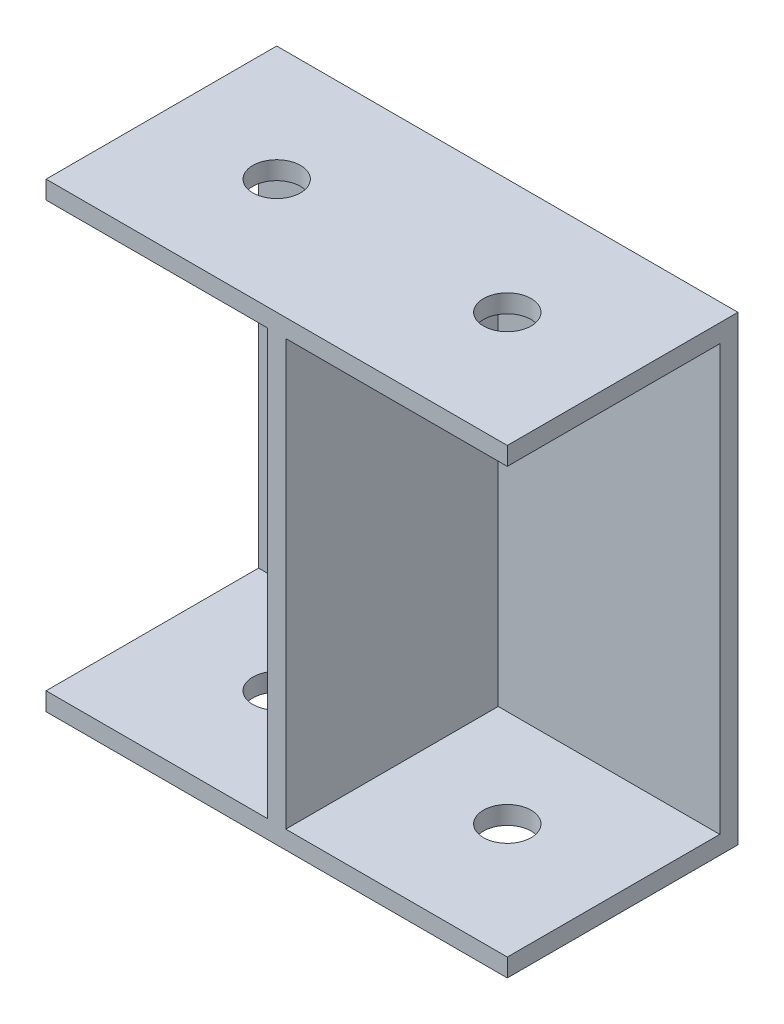
ISO-10303-21;
HEADER;
FILE_DESCRIPTION(('STEP AP214'),'2;1');
FILE_NAME('part.step','',(''),(''),'','','');
FILE_SCHEMA(('AUTOMOTIVE_DESIGN { 1 0 10303 214 1 1 1 1 }'));
ENDSEC;
DATA;
#1=APPLICATION_CONTEXT('core data for automotive mechanical design processes');
#2=APPLICATION_PROTOCOL_DEFINITION('international standard','automotive_design',2000,#1);
#3=PRODUCT_CONTEXT('',#1,'mechanical');
#4=PRODUCT('Part','Part','',(#3));
#5=PRODUCT_RELATED_PRODUCT_CATEGORY('part','',(#4));
#6=PRODUCT_DEFINITION_FORMATION('','',#4);
#7=PRODUCT_DEFINITION_CONTEXT('part definition',#1,'design');
#8=PRODUCT_DEFINITION('design','',#6,#7);
#9=PRODUCT_DEFINITION_SHAPE('','',#8);
#10=(LENGTH_UNIT() NAMED_UNIT(*) SI_UNIT(.MILLI.,.METRE.));
#11=(NAMED_UNIT(*) PLANE_ANGLE_UNIT() SI_UNIT($,.RADIAN.));
#12=(NAMED_UNIT(*) SI_UNIT($,.STERADIAN.) SOLID_ANGLE_UNIT());
#13=UNCERTAINTY_MEASURE_WITH_UNIT(LENGTH_MEASURE(1.E-05),#10,'distance_accuracy_value','');
#14=(GEOMETRIC_REPRESENTATION_CONTEXT(3) GLOBAL_UNCERTAINTY_ASSIGNED_CONTEXT((#13)) GLOBAL_UNIT_ASSIGNED_CONTEXT((#10,
#11,#12)) REPRESENTATION_CONTEXT('',''));
#15=CARTESIAN_POINT('',(0.,0.,0.));
#16=DIRECTION('',(0.,0.,1.));
#17=DIRECTION('',(1.,0.,0.));
#18=AXIS2_PLACEMENT_3D('',#15,#16,#17);
#19=CARTESIAN_POINT('',(38.1,-38.1,38.1));
#20=DIRECTION('',(-1.,0.,0.));
#21=DIRECTION('',(0.,0.,1.));
#22=AXIS2_PLACEMENT_3D('',#19,#20,#21);
#23=PLANE('',#22);
#24=DIRECTION('',(0.,1.,0.));
#25=VECTOR('',#24,1.);
#26=CARTESIAN_POINT('',(38.1,-38.1,38.1));
#27=LINE('',#26,#25);
#28=CARTESIAN_POINT('',(38.1,35.099999904,38.1));
#29=VERTEX_POINT('',#28);
#30=CARTESIAN_POINT('',(38.1,38.1,38.1));
#31=VERTEX_POINT('',#30);
#32=EDGE_CURVE('E181',#29,#31,#27,.T.);
#33=ORIENTED_EDGE('',*,*,#32,.F.);
#34=DIRECTION('',(0.,0.,-1.));
#35=VECTOR('',#34,1.);
#36=CARTESIAN_POINT('',(38.1,35.099999904,38.1));
#37=LINE('',#36,#35);
#38=CARTESIAN_POINT('',(38.1,35.099999904,2.9999999944));
#39=VERTEX_POINT('',#38);
#40=EDGE_CURVE('E173',#29,#39,#37,.T.);
#41=ORIENTED_EDGE('',*,*,#40,.T.);
#42=DIRECTION('',(0.,-1.,0.));
#43=VECTOR('',#42,1.);
#44=CARTESIAN_POINT('',(38.1,-38.1,2.9999999944));
#45=LINE('',#44,#43);
#46=CARTESIAN_POINT('',(38.1,-35.099999904,2.9999999944));
#47=VERTEX_POINT('',#46);
#48=EDGE_CURVE('E212',#39,#47,#45,.T.);
#49=ORIENTED_EDGE('',*,*,#48,.T.);
#50=DIRECTION('',(0.,0.,1.));
#51=VECTOR('',#50,1.);
#52=CARTESIAN_POINT('',(38.1,-35.099999904,38.1));
#53=LINE('',#52,#51);
#54=CARTESIAN_POINT('',(38.1,-35.099999904,38.1));
#55=VERTEX_POINT('',#54);
#56=EDGE_CURVE('E169',#47,#55,#53,.T.);
#57=ORIENTED_EDGE('',*,*,#56,.T.);
#58=CARTESIAN_POINT('',(38.1,-38.1,38.1));
#59=VERTEX_POINT('',#58);
#60=EDGE_CURVE('E177',#59,#55,#27,.T.);
#61=ORIENTED_EDGE('',*,*,#60,.F.);
#62=DIRECTION('',(0.,0.,-1.));
#63=VECTOR('',#62,1.);
#64=CARTESIAN_POINT('',(38.1,-38.1,38.1));
#65=LINE('',#64,#63);
#66=CARTESIAN_POINT('',(38.1,-38.1,0.));
#67=VERTEX_POINT('',#66);
#68=EDGE_CURVE('E189',#59,#67,#65,.T.);
#69=ORIENTED_EDGE('',*,*,#68,.T.);
#70=DIRECTION('',(0.,1.,0.));
#71=VECTOR('',#70,1.);
#72=CARTESIAN_POINT('',(38.1,-38.1,0.));
#73=LINE('',#72,#71);
#74=CARTESIAN_POINT('',(38.1,38.1,0.));
#75=VERTEX_POINT('',#74);
#76=EDGE_CURVE('E176',#67,#75,#73,.T.);
#77=ORIENTED_EDGE('',*,*,#76,.T.);
#78=DIRECTION('',(0.,0.,-1.));
#79=VECTOR('',#78,1.);
#80=CARTESIAN_POINT('',(38.1,38.1,38.1));
#81=LINE('',#80,#79);
#82=EDGE_CURVE('E206',#31,#75,#81,.T.);
#83=ORIENTED_EDGE('',*,*,#82,.F.);
#84=EDGE_LOOP('',(#33,#41,#49,#57,#61,#69,#77,#83));
#85=FACE_BOUND('',#84,.T.);
#86=ADVANCED_FACE('F32',(#85),#23,.F.);
#87=CARTESIAN_POINT('',(-38.1,38.1,38.1));
#88=DIRECTION('',(0.,-1.,0.));
#89=DIRECTION('',(0.,0.,-1.));
#90=AXIS2_PLACEMENT_3D('',#87,#88,#89);
#91=PLANE('',#90);
#92=CARTESIAN_POINT('',(-19.05,38.1,19.05));
#93=DIRECTION('',(0.,1.,0.));
#94=DIRECTION('',(0.,0.,-1.));
#95=AXIS2_PLACEMENT_3D('',#92,#93,#94);
#96=CIRCLE('',#95,3.937);
#97=CARTESIAN_POINT('',(-19.05,38.1,22.987));
#98=VERTEX_POINT('',#97);
#99=EDGE_CURVE('E232',#98,#98,#96,.T.);
#100=ORIENTED_EDGE('',*,*,#99,.F.);
#101=EDGE_LOOP('',(#100));
#102=FACE_BOUND('',#101,.T.);
#103=CARTESIAN_POINT('',(19.05,38.1,19.05));
#104=DIRECTION('',(0.,1.,0.));
#105=DIRECTION('',(0.,0.,1.));
#106=AXIS2_PLACEMENT_3D('',#103,#104,#105);
#107=CIRCLE('',#106,3.937);
#108=CARTESIAN_POINT('',(19.05,38.1,22.987));
#109=VERTEX_POINT('',#108);
#110=EDGE_CURVE('E222',#109,#109,#107,.T.);
#111=ORIENTED_EDGE('',*,*,#110,.F.);
#112=EDGE_LOOP('',(#111));
#113=FACE_BOUND('',#112,.T.);
#114=DIRECTION('',(-1.,0.,0.));
#115=VECTOR('',#114,1.);
#116=CARTESIAN_POINT('',(-38.1,38.1,0.));
#117=LINE('',#116,#115);
#118=CARTESIAN_POINT('',(-38.1,38.1,0.));
#119=VERTEX_POINT('',#118);
#120=EDGE_CURVE('E192',#75,#119,#117,.T.);
#121=ORIENTED_EDGE('',*,*,#120,.T.);
#122=DIRECTION('',(0.,0.,-1.));
#123=VECTOR('',#122,1.);
#124=CARTESIAN_POINT('',(-38.1,38.1,38.1));
#125=LINE('',#124,#123);
#126=CARTESIAN_POINT('',(-38.1,38.1,38.1));
#127=VERTEX_POINT('',#126);
#128=EDGE_CURVE('E203',#127,#119,#125,.T.);
#129=ORIENTED_EDGE('',*,*,#128,.F.);
#130=DIRECTION('',(-1.,0.,0.));
#131=VECTOR('',#130,1.);
#132=CARTESIAN_POINT('',(-38.1,38.1,38.1));
#133=LINE('',#132,#131);
#134=EDGE_CURVE('E180',#31,#127,#133,.T.);
#135=ORIENTED_EDGE('',*,*,#134,.F.);
#136=ORIENTED_EDGE('',*,*,#82,.T.);
#137=EDGE_LOOP('',(#121,#129,#135,#136));
#138=FACE_BOUND('',#137,.T.);
#139=ADVANCED_FACE('F260',(#102,#113,#138),#91,.F.);
#140=CARTESIAN_POINT('',(-38.1,-38.1,38.1));
#141=DIRECTION('',(1.,0.,0.));
#142=DIRECTION('',(0.,0.,-1.));
#143=AXIS2_PLACEMENT_3D('',#140,#141,#142);
#144=PLANE('',#143);
#145=DIRECTION('',(0.,-1.,0.));
#146=VECTOR('',#145,1.);
#147=CARTESIAN_POINT('',(-38.1,-38.1,38.1));
#148=LINE('',#147,#146);
#149=CARTESIAN_POINT('',(-38.1,-35.099999904,38.1));
#150=VERTEX_POINT('',#149);
#151=CARTESIAN_POINT('',(-38.1,-38.1,38.1));
#152=VERTEX_POINT('',#151);
#153=EDGE_CURVE('E183',#150,#152,#148,.T.);
#154=ORIENTED_EDGE('',*,*,#153,.F.);
#155=DIRECTION('',(0.,0.,-1.));
#156=VECTOR('',#155,1.);
#157=CARTESIAN_POINT('',(-38.1,-35.099999904,38.1));
#158=LINE('',#157,#156);
#159=CARTESIAN_POINT('',(-38.1,-35.099999904,2.9999999944));
#160=VERTEX_POINT('',#159);
#161=EDGE_CURVE('E153',#150,#160,#158,.T.);
#162=ORIENTED_EDGE('',*,*,#161,.T.);
#163=DIRECTION('',(0.,1.,0.));
#164=VECTOR('',#163,1.);
#165=CARTESIAN_POINT('',(-38.1,-38.1,2.9999999944));
#166=LINE('',#165,#164);
#167=CARTESIAN_POINT('',(-38.1,35.099999904,2.9999999944));
#168=VERTEX_POINT('',#167);
#169=EDGE_CURVE('E11',#160,#168,#166,.T.);
#170=ORIENTED_EDGE('',*,*,#169,.T.);
#171=DIRECTION('',(0.,0.,1.));
#172=VECTOR('',#171,1.);
#173=CARTESIAN_POINT('',(-38.1,35.099999904,38.1));
#174=LINE('',#173,#172);
#175=CARTESIAN_POINT('',(-38.1,35.099999904,38.1));
#176=VERTEX_POINT('',#175);
#177=EDGE_CURVE('E149',#168,#176,#174,.T.);
#178=ORIENTED_EDGE('',*,*,#177,.T.);
#179=EDGE_CURVE('E184',#127,#176,#148,.T.);
#180=ORIENTED_EDGE('',*,*,#179,.F.);
#181=ORIENTED_EDGE('',*,*,#128,.T.);
#182=DIRECTION('',(0.,-1.,0.));
#183=VECTOR('',#182,1.);
#184=CARTESIAN_POINT('',(-38.1,-38.1,0.));
#185=LINE('',#184,#183);
#186=CARTESIAN_POINT('',(-38.1,-38.1,0.));
#187=VERTEX_POINT('',#186);
#188=EDGE_CURVE('E194',#119,#187,#185,.T.);
#189=ORIENTED_EDGE('',*,*,#188,.T.);
#190=DIRECTION('',(0.,0.,-1.));
#191=VECTOR('',#190,1.);
#192=CARTESIAN_POINT('',(-38.1,-38.1,38.1));
#193=LINE('',#192,#191);
#194=EDGE_CURVE('E200',#152,#187,#193,.T.);
#195=ORIENTED_EDGE('',*,*,#194,.F.);
#196=EDGE_LOOP('',(#154,#162,#170,#178,#180,#181,#189,#195));
#197=FACE_BOUND('',#196,.T.);
#198=ADVANCED_FACE('F265',(#197),#144,.F.);
#199=CARTESIAN_POINT('',(-38.1,-38.1,38.1));
#200=DIRECTION('',(0.,1.,0.));
#201=DIRECTION('',(0.,0.,1.));
#202=AXIS2_PLACEMENT_3D('',#199,#200,#201);
#203=PLANE('',#202);
#204=CARTESIAN_POINT('',(-19.05,-38.1,19.05));
#205=DIRECTION('',(0.,1.,0.));
#206=DIRECTION('',(0.,0.,-1.));
#207=AXIS2_PLACEMENT_3D('',#204,#205,#206);
#208=CIRCLE('',#207,3.937);
#209=CARTESIAN_POINT('',(-19.05,-38.1,22.987));
#210=VERTEX_POINT('',#209);
#211=EDGE_CURVE('E235',#210,#210,#208,.T.);
#212=ORIENTED_EDGE('',*,*,#211,.T.);
#213=EDGE_LOOP('',(#212));
#214=FACE_BOUND('',#213,.T.);
#215=CARTESIAN_POINT('',(19.05,-38.1,19.05));
#216=DIRECTION('',(0.,1.,0.));
#217=DIRECTION('',(0.,0.,1.));
#218=AXIS2_PLACEMENT_3D('',#215,#216,#217);
#219=CIRCLE('',#218,3.937);
#220=CARTESIAN_POINT('',(19.05,-38.1,22.987));
#221=VERTEX_POINT('',#220);
#222=EDGE_CURVE('E217',#221,#221,#219,.T.);
#223=ORIENTED_EDGE('',*,*,#222,.T.);
#224=EDGE_LOOP('',(#223));
#225=FACE_BOUND('',#224,.T.);
#226=DIRECTION('',(1.,0.,0.));
#227=VECTOR('',#226,1.);
#228=CARTESIAN_POINT('',(-38.1,-38.1,0.));
#229=LINE('',#228,#227);
#230=EDGE_CURVE('E196',#187,#67,#229,.T.);
#231=ORIENTED_EDGE('',*,*,#230,.T.);
#232=ORIENTED_EDGE('',*,*,#68,.F.);
#233=DIRECTION('',(1.,0.,0.));
#234=VECTOR('',#233,1.);
#235=CARTESIAN_POINT('',(-38.1,-38.1,38.1));
#236=LINE('',#235,#234);
#237=EDGE_CURVE('E187',#152,#59,#236,.T.);
#238=ORIENTED_EDGE('',*,*,#237,.F.);
#239=ORIENTED_EDGE('',*,*,#194,.T.);
#240=EDGE_LOOP('',(#231,#232,#238,#239));
#241=FACE_BOUND('',#240,.T.);
#242=ADVANCED_FACE('F284',(#214,#225,#241),#203,.F.);
#243=CARTESIAN_POINT('',(0.,0.,38.1));
#244=DIRECTION('',(0.,0.,-1.));
#245=DIRECTION('',(-1.,0.,0.));
#246=AXIS2_PLACEMENT_3D('',#243,#244,#245);
#247=PLANE('',#246);
#248=DIRECTION('',(0.,1.,0.));
#249=VECTOR('',#248,1.);
#250=CARTESIAN_POINT('',(-1.4999999012,-35.099999904,38.1));
#251=LINE('',#250,#249);
#252=CARTESIAN_POINT('',(-1.4999999012,-35.099999904,38.1));
#253=VERTEX_POINT('',#252);
#254=CARTESIAN_POINT('',(-1.4999999012,35.099999904,38.1));
#255=VERTEX_POINT('',#254);
#256=EDGE_CURVE('E145',#253,#255,#251,.T.);
#257=ORIENTED_EDGE('',*,*,#256,.F.);
#258=DIRECTION('',(-1.,0.,0.));
#259=VECTOR('',#258,1.);
#260=CARTESIAN_POINT('',(0.,-35.099999904,38.1));
#261=LINE('',#260,#259);
#262=EDGE_CURVE('E40',#253,#150,#261,.T.);
#263=ORIENTED_EDGE('',*,*,#262,.T.);
#264=ORIENTED_EDGE('',*,*,#153,.T.);
#265=ORIENTED_EDGE('',*,*,#237,.T.);
#266=ORIENTED_EDGE('',*,*,#60,.T.);
#267=DIRECTION('',(1.,0.,0.));
#268=VECTOR('',#267,1.);
#269=CARTESIAN_POINT('',(1.5000000932,-35.099999904,38.1));
#270=LINE('',#269,#268);
#271=CARTESIAN_POINT('',(1.5000000932,-35.099999904,38.1));
#272=VERTEX_POINT('',#271);
#273=EDGE_CURVE('E159',#272,#55,#270,.T.);
#274=ORIENTED_EDGE('',*,*,#273,.F.);
#275=DIRECTION('',(0.,-1.,0.));
#276=VECTOR('',#275,1.);
#277=CARTESIAN_POINT('',(1.5000000932,-35.099999904,38.1));
#278=LINE('',#277,#276);
#279=CARTESIAN_POINT('',(1.5000000932,35.099999904,38.1));
#280=VERTEX_POINT('',#279);
#281=EDGE_CURVE('E56',#280,#272,#278,.T.);
#282=ORIENTED_EDGE('',*,*,#281,.F.);
#283=DIRECTION('',(1.,0.,0.));
#284=VECTOR('',#283,1.);
#285=CARTESIAN_POINT('',(0.,35.099999904,38.1));
#286=LINE('',#285,#284);
#287=EDGE_CURVE('E209',#280,#29,#286,.T.);
#288=ORIENTED_EDGE('',*,*,#287,.T.);
#289=ORIENTED_EDGE('',*,*,#32,.T.);
#290=ORIENTED_EDGE('',*,*,#134,.T.);
#291=ORIENTED_EDGE('',*,*,#179,.T.);
#292=DIRECTION('',(-1.,0.,0.));
#293=VECTOR('',#292,1.);
#294=CARTESIAN_POINT('',(-1.4999999012,35.099999904,38.1));
#295=LINE('',#294,#293);
#296=EDGE_CURVE('E131',#255,#176,#295,.T.);
#297=ORIENTED_EDGE('',*,*,#296,.F.);
#298=EDGE_LOOP('',(#257,#263,#264,#265,#266,#274,#282,#288,#289,#290,#291,#297));
#299=FACE_BOUND('',#298,.T.);
#300=ADVANCED_FACE('F271',(#299),#247,.F.);
#301=CARTESIAN_POINT('',(0.,0.,0.));
#302=DIRECTION('',(0.,0.,-1.));
#303=DIRECTION('',(-1.,0.,0.));
#304=AXIS2_PLACEMENT_3D('',#301,#302,#303);
#305=PLANE('',#304);
#306=ORIENTED_EDGE('',*,*,#76,.F.);
#307=ORIENTED_EDGE('',*,*,#230,.F.);
#308=ORIENTED_EDGE('',*,*,#188,.F.);
#309=ORIENTED_EDGE('',*,*,#120,.F.);
#310=EDGE_LOOP('',(#306,#307,#308,#309));
#311=FACE_BOUND('',#310,.T.);
#312=ADVANCED_FACE('F307',(#311),#305,.T.);
#313=CARTESIAN_POINT('',(0.,0.,2.9999999944));
#314=DIRECTION('',(0.,0.,-1.));
#315=DIRECTION('',(-1.,0.,0.));
#316=AXIS2_PLACEMENT_3D('',#313,#314,#315);
#317=PLANE('',#316);
#318=DIRECTION('',(-1.,0.,0.));
#319=VECTOR('',#318,1.);
#320=CARTESIAN_POINT('',(1.5000000932,35.099999904,2.9999999944));
#321=LINE('',#320,#319);
#322=CARTESIAN_POINT('',(1.5000000932,35.099999904,2.9999999944));
#323=VERTEX_POINT('',#322);
#324=EDGE_CURVE('E162',#39,#323,#321,.T.);
#325=ORIENTED_EDGE('',*,*,#324,.T.);
#326=DIRECTION('',(0.,-1.,0.));
#327=VECTOR('',#326,1.);
#328=CARTESIAN_POINT('',(1.5000000932,-35.099999904,2.9999999944));
#329=LINE('',#328,#327);
#330=CARTESIAN_POINT('',(1.5000000932,-35.099999904,2.9999999944));
#331=VERTEX_POINT('',#330);
#332=EDGE_CURVE('E155',#323,#331,#329,.T.);
#333=ORIENTED_EDGE('',*,*,#332,.T.);
#334=DIRECTION('',(1.,0.,0.));
#335=VECTOR('',#334,1.);
#336=CARTESIAN_POINT('',(1.5000000932,-35.099999904,2.9999999944));
#337=LINE('',#336,#335);
#338=EDGE_CURVE('E158',#331,#47,#337,.T.);
#339=ORIENTED_EDGE('',*,*,#338,.T.);
#340=ORIENTED_EDGE('',*,*,#48,.F.);
#341=EDGE_LOOP('',(#325,#333,#339,#340));
#342=FACE_BOUND('',#341,.T.);
#343=ADVANCED_FACE('F295',(#342),#317,.F.);
#344=CARTESIAN_POINT('',(1.5000000932,35.099999904,2.9999999944));
#345=DIRECTION('',(0.,1.,0.));
#346=DIRECTION('',(0.,0.,1.));
#347=AXIS2_PLACEMENT_3D('',#344,#345,#346);
#348=PLANE('',#347);
#349=CARTESIAN_POINT('',(19.05,35.099999904,19.05));
#350=DIRECTION('',(0.,1.,0.));
#351=DIRECTION('',(0.,0.,1.));
#352=AXIS2_PLACEMENT_3D('',#349,#350,#351);
#353=CIRCLE('',#352,3.937);
#354=CARTESIAN_POINT('',(19.05,35.099999904,22.987));
#355=VERTEX_POINT('',#354);
#356=EDGE_CURVE('E147',#355,#355,#353,.T.);
#357=ORIENTED_EDGE('',*,*,#356,.T.);
#358=EDGE_LOOP('',(#357));
#359=FACE_BOUND('',#358,.T.);
#360=ORIENTED_EDGE('',*,*,#287,.F.);
#361=DIRECTION('',(0.,0.,1.));
#362=VECTOR('',#361,1.);
#363=CARTESIAN_POINT('',(1.5000000932,35.099999904,2.9999999944));
#364=LINE('',#363,#362);
#365=EDGE_CURVE('E167',#323,#280,#364,.T.);
#366=ORIENTED_EDGE('',*,*,#365,.F.);
#367=ORIENTED_EDGE('',*,*,#324,.F.);
#368=ORIENTED_EDGE('',*,*,#40,.F.);
#369=EDGE_LOOP('',(#360,#366,#367,#368));
#370=FACE_BOUND('',#369,.T.);
#371=ADVANCED_FACE('F298',(#359,#370),#348,.F.);
#372=CARTESIAN_POINT('',(1.5000000932,-35.099999904,2.9999999944));
#373=DIRECTION('',(0.,-1.,0.));
#374=DIRECTION('',(0.,0.,-1.));
#375=AXIS2_PLACEMENT_3D('',#372,#373,#374);
#376=PLANE('',#375);
#377=CARTESIAN_POINT('',(19.05,-35.099999904,19.05));
#378=DIRECTION('',(0.,-1.,0.));
#379=DIRECTION('',(0.,0.,-1.));
#380=AXIS2_PLACEMENT_3D('',#377,#378,#379);
#381=CIRCLE('',#380,3.937);
#382=CARTESIAN_POINT('',(19.05,-35.099999904,22.987));
#383=VERTEX_POINT('',#382);
#384=EDGE_CURVE('E215',#383,#383,#381,.T.);
#385=ORIENTED_EDGE('',*,*,#384,.T.);
#386=EDGE_LOOP('',(#385));
#387=FACE_BOUND('',#386,.T.);
#388=ORIENTED_EDGE('',*,*,#338,.F.);
#389=DIRECTION('',(0.,0.,1.));
#390=VECTOR('',#389,1.);
#391=CARTESIAN_POINT('',(1.5000000932,-35.099999904,2.9999999944));
#392=LINE('',#391,#390);
#393=EDGE_CURVE('E164',#331,#272,#392,.T.);
#394=ORIENTED_EDGE('',*,*,#393,.T.);
#395=ORIENTED_EDGE('',*,*,#273,.T.);
#396=ORIENTED_EDGE('',*,*,#56,.F.);
#397=EDGE_LOOP('',(#388,#394,#395,#396));
#398=FACE_BOUND('',#397,.T.);
#399=ADVANCED_FACE('F290',(#387,#398),#376,.F.);
#400=CARTESIAN_POINT('',(1.5000000932,-35.099999904,2.9999999944));
#401=DIRECTION('',(-1.,0.,0.));
#402=DIRECTION('',(0.,0.,1.));
#403=AXIS2_PLACEMENT_3D('',#400,#401,#402);
#404=PLANE('',#403);
#405=ORIENTED_EDGE('',*,*,#281,.T.);
#406=ORIENTED_EDGE('',*,*,#393,.F.);
#407=ORIENTED_EDGE('',*,*,#332,.F.);
#408=ORIENTED_EDGE('',*,*,#365,.T.);
#409=EDGE_LOOP('',(#405,#406,#407,#408));
#410=FACE_BOUND('',#409,.T.);
#411=ADVANCED_FACE('F292',(#410),#404,.F.);
#412=CARTESIAN_POINT('',(0.,0.,2.9999999944));
#413=DIRECTION('',(0.,0.,-1.));
#414=DIRECTION('',(-1.,0.,0.));
#415=AXIS2_PLACEMENT_3D('',#412,#413,#414);
#416=PLANE('',#415);
#417=DIRECTION('',(1.,0.,0.));
#418=VECTOR('',#417,1.);
#419=CARTESIAN_POINT('',(-1.4999999012,-35.099999904,2.9999999944));
#420=LINE('',#419,#418);
#421=CARTESIAN_POINT('',(-1.4999999012,-35.099999904,2.9999999944));
#422=VERTEX_POINT('',#421);
#423=EDGE_CURVE('E125',#160,#422,#420,.T.);
#424=ORIENTED_EDGE('',*,*,#423,.T.);
#425=DIRECTION('',(0.,1.,0.));
#426=VECTOR('',#425,1.);
#427=CARTESIAN_POINT('',(-1.4999999012,-35.099999904,2.9999999944));
#428=LINE('',#427,#426);
#429=CARTESIAN_POINT('',(-1.4999999012,35.099999904,2.9999999944));
#430=VERTEX_POINT('',#429);
#431=EDGE_CURVE('E128',#422,#430,#428,.T.);
#432=ORIENTED_EDGE('',*,*,#431,.T.);
#433=DIRECTION('',(-1.,0.,0.));
#434=VECTOR('',#433,1.);
#435=CARTESIAN_POINT('',(-1.4999999012,35.099999904,2.9999999944));
#436=LINE('',#435,#434);
#437=EDGE_CURVE('E137',#430,#168,#436,.T.);
#438=ORIENTED_EDGE('',*,*,#437,.T.);
#439=ORIENTED_EDGE('',*,*,#169,.F.);
#440=EDGE_LOOP('',(#424,#432,#438,#439));
#441=FACE_BOUND('',#440,.T.);
#442=ADVANCED_FACE('F126',(#441),#416,.F.);
#443=CARTESIAN_POINT('',(-1.4999999012,-35.099999904,2.9999999944));
#444=DIRECTION('',(0.,-1.,0.));
#445=DIRECTION('',(0.,0.,-1.));
#446=AXIS2_PLACEMENT_3D('',#443,#444,#445);
#447=PLANE('',#446);
#448=CARTESIAN_POINT('',(-19.05,-35.099999904,19.05));
#449=DIRECTION('',(0.,-1.,0.));
#450=DIRECTION('',(0.,0.,-1.));
#451=AXIS2_PLACEMENT_3D('',#448,#449,#450);
#452=CIRCLE('',#451,3.937);
#453=CARTESIAN_POINT('',(-19.05,-35.099999904,22.987));
#454=VERTEX_POINT('',#453);
#455=EDGE_CURVE('E227',#454,#454,#452,.T.);
#456=ORIENTED_EDGE('',*,*,#455,.T.);
#457=EDGE_LOOP('',(#456));
#458=FACE_BOUND('',#457,.T.);
#459=ORIENTED_EDGE('',*,*,#262,.F.);
#460=DIRECTION('',(0.,0.,1.));
#461=VECTOR('',#460,1.);
#462=CARTESIAN_POINT('',(-1.4999999012,-35.099999904,2.9999999944));
#463=LINE('',#462,#461);
#464=EDGE_CURVE('E48',#422,#253,#463,.T.);
#465=ORIENTED_EDGE('',*,*,#464,.F.);
#466=ORIENTED_EDGE('',*,*,#423,.F.);
#467=ORIENTED_EDGE('',*,*,#161,.F.);
#468=EDGE_LOOP('',(#459,#465,#466,#467));
#469=FACE_BOUND('',#468,.T.);
#470=ADVANCED_FACE('F133',(#458,#469),#447,.F.);
#471=CARTESIAN_POINT('',(-1.4999999012,35.099999904,2.9999999944));
#472=DIRECTION('',(0.,1.,0.));
#473=DIRECTION('',(0.,0.,1.));
#474=AXIS2_PLACEMENT_3D('',#471,#472,#473);
#475=PLANE('',#474);
#476=CARTESIAN_POINT('',(-19.05,35.099999904,19.05));
#477=DIRECTION('',(0.,1.,0.));
#478=DIRECTION('',(0.,0.,1.));
#479=AXIS2_PLACEMENT_3D('',#476,#477,#478);
#480=CIRCLE('',#479,3.937);
#481=CARTESIAN_POINT('',(-19.05,35.099999904,22.987));
#482=VERTEX_POINT('',#481);
#483=EDGE_CURVE('E35',#482,#482,#480,.T.);
#484=ORIENTED_EDGE('',*,*,#483,.T.);
#485=EDGE_LOOP('',(#484));
#486=FACE_BOUND('',#485,.T.);
#487=ORIENTED_EDGE('',*,*,#437,.F.);
#488=DIRECTION('',(0.,0.,1.));
#489=VECTOR('',#488,1.);
#490=CARTESIAN_POINT('',(-1.4999999012,35.099999904,2.9999999944));
#491=LINE('',#490,#489);
#492=EDGE_CURVE('E136',#430,#255,#491,.T.);
#493=ORIENTED_EDGE('',*,*,#492,.T.);
#494=ORIENTED_EDGE('',*,*,#296,.T.);
#495=ORIENTED_EDGE('',*,*,#177,.F.);
#496=EDGE_LOOP('',(#487,#493,#494,#495));
#497=FACE_BOUND('',#496,.T.);
#498=ADVANCED_FACE('F242',(#486,#497),#475,.F.);
#499=CARTESIAN_POINT('',(-1.4999999012,-35.099999904,2.9999999944));
#500=DIRECTION('',(1.,0.,0.));
#501=DIRECTION('',(0.,0.,-1.));
#502=AXIS2_PLACEMENT_3D('',#499,#500,#501);
#503=PLANE('',#502);
#504=ORIENTED_EDGE('',*,*,#256,.T.);
#505=ORIENTED_EDGE('',*,*,#492,.F.);
#506=ORIENTED_EDGE('',*,*,#431,.F.);
#507=ORIENTED_EDGE('',*,*,#464,.T.);
#508=EDGE_LOOP('',(#504,#505,#506,#507));
#509=FACE_BOUND('',#508,.T.);
#510=ADVANCED_FACE('F139',(#509),#503,.F.);
#511=CARTESIAN_POINT('',(19.05,-38.1,19.05));
#512=DIRECTION('',(0.,1.,0.));
#513=DIRECTION('',(0.,0.,1.));
#514=AXIS2_PLACEMENT_3D('',#511,#512,#513);
#515=CYLINDRICAL_SURFACE('',#514,3.937);
#516=CARTESIAN_POINT('',(19.05,-38.1,22.987));
#517=CARTESIAN_POINT('',(19.05,-38.068749999,22.987));
#518=CARTESIAN_POINT('',(19.05,-38.037499998,22.987));
#519=CARTESIAN_POINT('',(19.05,-37.974999996,22.987));
#520=CARTESIAN_POINT('',(19.05,-37.943749995,22.987));
#521=CARTESIAN_POINT('',(19.05,-37.881249993,22.987));
#522=CARTESIAN_POINT('',(19.05,-37.849999992,22.987));
#523=CARTESIAN_POINT('',(19.05,-37.78749999,22.987));
#524=CARTESIAN_POINT('',(19.05,-37.756249989,22.987));
#525=CARTESIAN_POINT('',(19.05,-37.693749987,22.987));
#526=CARTESIAN_POINT('',(19.05,-37.662499986,22.987));
#527=CARTESIAN_POINT('',(19.05,-37.599999984,22.987));
#528=CARTESIAN_POINT('',(19.05,-37.568749983,22.987));
#529=CARTESIAN_POINT('',(19.05,-37.506249981,22.987));
#530=CARTESIAN_POINT('',(19.05,-37.47499998,22.987));
#531=CARTESIAN_POINT('',(19.05,-37.412499978,22.987));
#532=CARTESIAN_POINT('',(19.05,-37.381249977,22.987));
#533=CARTESIAN_POINT('',(19.05,-37.318749975,22.987));
#534=CARTESIAN_POINT('',(19.05,-37.287499974,22.987));
#535=CARTESIAN_POINT('',(19.05,-37.224999972,22.987));
#536=CARTESIAN_POINT('',(19.05,-37.193749971,22.987));
#537=CARTESIAN_POINT('',(19.05,-37.131249969,22.987));
#538=CARTESIAN_POINT('',(19.05,-37.099999968,22.987));
#539=CARTESIAN_POINT('',(19.05,-37.037499966,22.987));
#540=CARTESIAN_POINT('',(19.05,-37.006249965,22.987));
#541=CARTESIAN_POINT('',(19.05,-36.943749963,22.987));
#542=CARTESIAN_POINT('',(19.05,-36.912499962,22.987));
#543=CARTESIAN_POINT('',(19.05,-36.84999996,22.987));
#544=CARTESIAN_POINT('',(19.05,-36.818749959,22.987));
#545=CARTESIAN_POINT('',(19.05,-36.756249957,22.987));
#546=CARTESIAN_POINT('',(19.05,-36.724999956,22.987));
#547=CARTESIAN_POINT('',(19.05,-36.662499954,22.987));
#548=CARTESIAN_POINT('',(19.05,-36.631249953,22.987));
#549=CARTESIAN_POINT('',(19.05,-36.568749951,22.987));
#550=CARTESIAN_POINT('',(19.05,-36.53749995,22.987));
#551=CARTESIAN_POINT('',(19.05,-36.474999948,22.987));
#552=CARTESIAN_POINT('',(19.05,-36.443749947,22.987));
#553=CARTESIAN_POINT('',(19.05,-36.381249945,22.987));
#554=CARTESIAN_POINT('',(19.05,-36.349999944,22.987));
#555=CARTESIAN_POINT('',(19.05,-36.287499942,22.987));
#556=CARTESIAN_POINT('',(19.05,-36.256249941,22.987));
#557=CARTESIAN_POINT('',(19.05,-36.193749939,22.987));
#558=CARTESIAN_POINT('',(19.05,-36.162499938,22.987));
#559=CARTESIAN_POINT('',(19.05,-36.099999936,22.987));
#560=CARTESIAN_POINT('',(19.05,-36.068749935,22.987));
#561=CARTESIAN_POINT('',(19.05,-36.006249933,22.987));
#562=CARTESIAN_POINT('',(19.05,-35.974999932,22.987));
#563=CARTESIAN_POINT('',(19.05,-35.91249993,22.987));
#564=CARTESIAN_POINT('',(19.05,-35.881249929,22.987));
#565=CARTESIAN_POINT('',(19.05,-35.818749927,22.987));
#566=CARTESIAN_POINT('',(19.05,-35.787499926,22.987));
#567=CARTESIAN_POINT('',(19.05,-35.724999924,22.987));
#568=CARTESIAN_POINT('',(19.05,-35.693749923,22.987));
#569=CARTESIAN_POINT('',(19.05,-35.631249921,22.987));
#570=CARTESIAN_POINT('',(19.05,-35.59999992,22.987));
#571=CARTESIAN_POINT('',(19.05,-35.537499918,22.987));
#572=CARTESIAN_POINT('',(19.05,-35.506249917,22.987));
#573=CARTESIAN_POINT('',(19.05,-35.443749915,22.987));
#574=CARTESIAN_POINT('',(19.05,-35.412499914,22.987));
#575=CARTESIAN_POINT('',(19.05,-35.349999912,22.987));
#576=CARTESIAN_POINT('',(19.05,-35.318749911,22.987));
#577=CARTESIAN_POINT('',(19.05,-35.256249909,22.987));
#578=CARTESIAN_POINT('',(19.05,-35.224999908,22.987));
#579=CARTESIAN_POINT('',(19.05,-35.162499906,22.987));
#580=CARTESIAN_POINT('',(19.05,-35.131249905,22.987));
#581=CARTESIAN_POINT('',(19.05,-35.099999904,22.987));
#582=B_SPLINE_CURVE_WITH_KNOTS('',3,(#516,#517,#518,#519,#520,#521,#522,#523,#524,#525,#526,
#527,#528,#529,#530,#531,#532,#533,#534,#535,#536,#537,#538,#539,#540,#541,#542,#543,#544,#545,
#546,#547,#548,#549,#550,#551,#552,#553,#554,#555,#556,#557,#558,#559,#560,#561,#562,#563,#564,
#565,#566,#567,#568,#569,#570,#571,#572,#573,#574,#575,#576,#577,#578,#579,#580,#581),
.UNSPECIFIED.,.F.,.F.,(4,2,2,2,2,2,2,2,2,2,2,2,2,2,2,2,2,2,2,2,2,2,2,2,2,2,2,2,2,2,2,2,4),(0.,
0.0937500030000066,0.187500006000006,0.281250009000006,0.375000012000005,0.468750015000005,
0.562500018000005,0.656250021000004,0.750000024000004,0.843750027000004,0.937500030000003,
1.031250033,1.12500003600001,1.21875003900001,1.31250004200001,1.40625004500001,
1.50000004800001,1.59375005100001,1.68750005400001,1.78125005700001,1.87500006000001,
1.96875006300001,2.06250006600001,2.15625006900001,2.25000007200001,2.34375007500001,
2.43750007800001,2.53125008100001,2.62500008400001,2.71875008700001,2.81250009000001,
2.90625009300001,3.00000009600001),.UNSPECIFIED.);
#583=EDGE_CURVE('BSEAM256',#221,#383,#582,.T.);
#584=ORIENTED_EDGE('',*,*,#222,.F.);
#585=ORIENTED_EDGE('',*,*,#384,.F.);
#586=ORIENTED_EDGE('',*,*,#583,.T.);
#587=ORIENTED_EDGE('',*,*,#583,.F.);
#588=EDGE_LOOP('',(#584,#586,#585,#587));
#589=FACE_BOUND('',#588,.T.);
#590=ADVANCED_FACE('F256',(#589),#515,.F.);
#591=CARTESIAN_POINT('',(19.05,38.1,22.987));
#592=CARTESIAN_POINT('',(19.05,38.068749999,22.987));
#593=CARTESIAN_POINT('',(19.05,38.037499998,22.987));
#594=CARTESIAN_POINT('',(19.05,37.974999996,22.987));
#595=CARTESIAN_POINT('',(19.05,37.943749995,22.987));
#596=CARTESIAN_POINT('',(19.05,37.881249993,22.987));
#597=CARTESIAN_POINT('',(19.05,37.849999992,22.987));
#598=CARTESIAN_POINT('',(19.05,37.78749999,22.987));
#599=CARTESIAN_POINT('',(19.05,37.756249989,22.987));
#600=CARTESIAN_POINT('',(19.05,37.693749987,22.987));
#601=CARTESIAN_POINT('',(19.05,37.662499986,22.987));
#602=CARTESIAN_POINT('',(19.05,37.599999984,22.987));
#603=CARTESIAN_POINT('',(19.05,37.568749983,22.987));
#604=CARTESIAN_POINT('',(19.05,37.506249981,22.987));
#605=CARTESIAN_POINT('',(19.05,37.47499998,22.987));
#606=CARTESIAN_POINT('',(19.05,37.412499978,22.987));
#607=CARTESIAN_POINT('',(19.05,37.381249977,22.987));
#608=CARTESIAN_POINT('',(19.05,37.318749975,22.987));
#609=CARTESIAN_POINT('',(19.05,37.287499974,22.987));
#610=CARTESIAN_POINT('',(19.05,37.224999972,22.987));
#611=CARTESIAN_POINT('',(19.05,37.193749971,22.987));
#612=CARTESIAN_POINT('',(19.05,37.131249969,22.987));
#613=CARTESIAN_POINT('',(19.05,37.099999968,22.987));
#614=CARTESIAN_POINT('',(19.05,37.037499966,22.987));
#615=CARTESIAN_POINT('',(19.05,37.006249965,22.987));
#616=CARTESIAN_POINT('',(19.05,36.943749963,22.987));
#617=CARTESIAN_POINT('',(19.05,36.912499962,22.987));
#618=CARTESIAN_POINT('',(19.05,36.84999996,22.987));
#619=CARTESIAN_POINT('',(19.05,36.818749959,22.987));
#620=CARTESIAN_POINT('',(19.05,36.756249957,22.987));
#621=CARTESIAN_POINT('',(19.05,36.724999956,22.987));
#622=CARTESIAN_POINT('',(19.05,36.662499954,22.987));
#623=CARTESIAN_POINT('',(19.05,36.631249953,22.987));
#624=CARTESIAN_POINT('',(19.05,36.568749951,22.987));
#625=CARTESIAN_POINT('',(19.05,36.53749995,22.987));
#626=CARTESIAN_POINT('',(19.05,36.474999948,22.987));
#627=CARTESIAN_POINT('',(19.05,36.443749947,22.987));
#628=CARTESIAN_POINT('',(19.05,36.381249945,22.987));
#629=CARTESIAN_POINT('',(19.05,36.349999944,22.987));
#630=CARTESIAN_POINT('',(19.05,36.287499942,22.987));
#631=CARTESIAN_POINT('',(19.05,36.256249941,22.987));
#632=CARTESIAN_POINT('',(19.05,36.193749939,22.987));
#633=CARTESIAN_POINT('',(19.05,36.162499938,22.987));
#634=CARTESIAN_POINT('',(19.05,36.099999936,22.987));
#635=CARTESIAN_POINT('',(19.05,36.068749935,22.987));
#636=CARTESIAN_POINT('',(19.05,36.006249933,22.987));
#637=CARTESIAN_POINT('',(19.05,35.974999932,22.987));
#638=CARTESIAN_POINT('',(19.05,35.91249993,22.987));
#639=CARTESIAN_POINT('',(19.05,35.881249929,22.987));
#640=CARTESIAN_POINT('',(19.05,35.818749927,22.987));
#641=CARTESIAN_POINT('',(19.05,35.787499926,22.987));
#642=CARTESIAN_POINT('',(19.05,35.724999924,22.987));
#643=CARTESIAN_POINT('',(19.05,35.693749923,22.987));
#644=CARTESIAN_POINT('',(19.05,35.631249921,22.987));
#645=CARTESIAN_POINT('',(19.05,35.59999992,22.987));
#646=CARTESIAN_POINT('',(19.05,35.537499918,22.987));
#647=CARTESIAN_POINT('',(19.05,35.506249917,22.987));
#648=CARTESIAN_POINT('',(19.05,35.443749915,22.987));
#649=CARTESIAN_POINT('',(19.05,35.412499914,22.987));
#650=CARTESIAN_POINT('',(19.05,35.349999912,22.987));
#651=CARTESIAN_POINT('',(19.05,35.318749911,22.987));
#652=CARTESIAN_POINT('',(19.05,35.256249909,22.987));
#653=CARTESIAN_POINT('',(19.05,35.224999908,22.987));
#654=CARTESIAN_POINT('',(19.05,35.162499906,22.987));
#655=CARTESIAN_POINT('',(19.05,35.131249905,22.987));
#656=CARTESIAN_POINT('',(19.05,35.099999904,22.987));
#657=B_SPLINE_CURVE_WITH_KNOTS('',3,(#591,#592,#593,#594,#595,#596,#597,#598,#599,#600,#601,
#602,#603,#604,#605,#606,#607,#608,#609,#610,#611,#612,#613,#614,#615,#616,#617,#618,#619,#620,
#621,#622,#623,#624,#625,#626,#627,#628,#629,#630,#631,#632,#633,#634,#635,#636,#637,#638,#639,
#640,#641,#642,#643,#644,#645,#646,#647,#648,#649,#650,#651,#652,#653,#654,#655,#656),
.UNSPECIFIED.,.F.,.F.,(4,2,2,2,2,2,2,2,2,2,2,2,2,2,2,2,2,2,2,2,2,2,2,2,2,2,2,2,2,2,2,2,4),(0.,
0.0937500030000066,0.187500005999999,0.281250009000006,0.375000011999999,0.468750015000005,
0.562500017999998,0.656250021000004,0.750000023999997,0.843750027000004,0.93750003000001,
1.031250033,1.12500003600001,1.218750039,1.31250004200001,1.406250045,1.50000004800001,
1.59375005100001,1.68750005400001,1.78125005700001,1.87500006000001,1.96875006300001,
2.06250006600001,2.15625006900001,2.25000007200002,2.34375007500001,2.43750007800002,
2.53125008100001,2.62500008400002,2.71875008700001,2.81250009000002,2.90625009300001,
3.00000009600002),.UNSPECIFIED.);
#658=EDGE_CURVE('BSEAM248',#109,#355,#657,.T.);
#659=ORIENTED_EDGE('',*,*,#110,.T.);
#660=ORIENTED_EDGE('',*,*,#356,.F.);
#661=ORIENTED_EDGE('',*,*,#658,.T.);
#662=ORIENTED_EDGE('',*,*,#658,.F.);
#663=EDGE_LOOP('',(#659,#661,#660,#662));
#664=FACE_BOUND('',#663,.T.);
#665=ADVANCED_FACE('F248',(#664),#515,.F.);
#666=CARTESIAN_POINT('',(-19.05,-38.1,19.05));
#667=DIRECTION('',(0.,1.,0.));
#668=DIRECTION('',(0.,0.,1.));
#669=AXIS2_PLACEMENT_3D('',#666,#667,#668);
#670=CYLINDRICAL_SURFACE('',#669,3.937);
#671=CARTESIAN_POINT('',(-19.05,38.1,22.987));
#672=CARTESIAN_POINT('',(-19.05,38.068749999,22.987));
#673=CARTESIAN_POINT('',(-19.05,38.037499998,22.987));
#674=CARTESIAN_POINT('',(-19.05,37.974999996,22.987));
#675=CARTESIAN_POINT('',(-19.05,37.943749995,22.987));
#676=CARTESIAN_POINT('',(-19.05,37.881249993,22.987));
#677=CARTESIAN_POINT('',(-19.05,37.849999992,22.987));
#678=CARTESIAN_POINT('',(-19.05,37.78749999,22.987));
#679=CARTESIAN_POINT('',(-19.05,37.756249989,22.987));
#680=CARTESIAN_POINT('',(-19.05,37.693749987,22.987));
#681=CARTESIAN_POINT('',(-19.05,37.662499986,22.987));
#682=CARTESIAN_POINT('',(-19.05,37.599999984,22.987));
#683=CARTESIAN_POINT('',(-19.05,37.568749983,22.987));
#684=CARTESIAN_POINT('',(-19.05,37.506249981,22.987));
#685=CARTESIAN_POINT('',(-19.05,37.47499998,22.987));
#686=CARTESIAN_POINT('',(-19.05,37.412499978,22.987));
#687=CARTESIAN_POINT('',(-19.05,37.381249977,22.987));
#688=CARTESIAN_POINT('',(-19.05,37.318749975,22.987));
#689=CARTESIAN_POINT('',(-19.05,37.287499974,22.987));
#690=CARTESIAN_POINT('',(-19.05,37.224999972,22.987));
#691=CARTESIAN_POINT('',(-19.05,37.193749971,22.987));
#692=CARTESIAN_POINT('',(-19.05,37.131249969,22.987));
#693=CARTESIAN_POINT('',(-19.05,37.099999968,22.987));
#694=CARTESIAN_POINT('',(-19.05,37.037499966,22.987));
#695=CARTESIAN_POINT('',(-19.05,37.006249965,22.987));
#696=CARTESIAN_POINT('',(-19.05,36.943749963,22.987));
#697=CARTESIAN_POINT('',(-19.05,36.912499962,22.987));
#698=CARTESIAN_POINT('',(-19.05,36.84999996,22.987));
#699=CARTESIAN_POINT('',(-19.05,36.818749959,22.987));
#700=CARTESIAN_POINT('',(-19.05,36.756249957,22.987));
#701=CARTESIAN_POINT('',(-19.05,36.724999956,22.987));
#702=CARTESIAN_POINT('',(-19.05,36.662499954,22.987));
#703=CARTESIAN_POINT('',(-19.05,36.631249953,22.987));
#704=CARTESIAN_POINT('',(-19.05,36.568749951,22.987));
#705=CARTESIAN_POINT('',(-19.05,36.53749995,22.987));
#706=CARTESIAN_POINT('',(-19.05,36.474999948,22.987));
#707=CARTESIAN_POINT('',(-19.05,36.443749947,22.987));
#708=CARTESIAN_POINT('',(-19.05,36.381249945,22.987));
#709=CARTESIAN_POINT('',(-19.05,36.349999944,22.987));
#710=CARTESIAN_POINT('',(-19.05,36.287499942,22.987));
#711=CARTESIAN_POINT('',(-19.05,36.256249941,22.987));
#712=CARTESIAN_POINT('',(-19.05,36.193749939,22.987));
#713=CARTESIAN_POINT('',(-19.05,36.162499938,22.987));
#714=CARTESIAN_POINT('',(-19.05,36.099999936,22.987));
#715=CARTESIAN_POINT('',(-19.05,36.068749935,22.987));
#716=CARTESIAN_POINT('',(-19.05,36.006249933,22.987));
#717=CARTESIAN_POINT('',(-19.05,35.974999932,22.987));
#718=CARTESIAN_POINT('',(-19.05,35.91249993,22.987));
#719=CARTESIAN_POINT('',(-19.05,35.881249929,22.987));
#720=CARTESIAN_POINT('',(-19.05,35.818749927,22.987));
#721=CARTESIAN_POINT('',(-19.05,35.787499926,22.987));
#722=CARTESIAN_POINT('',(-19.05,35.724999924,22.987));
#723=CARTESIAN_POINT('',(-19.05,35.693749923,22.987));
#724=CARTESIAN_POINT('',(-19.05,35.631249921,22.987));
#725=CARTESIAN_POINT('',(-19.05,35.59999992,22.987));
#726=CARTESIAN_POINT('',(-19.05,35.537499918,22.987));
#727=CARTESIAN_POINT('',(-19.05,35.506249917,22.987));
#728=CARTESIAN_POINT('',(-19.05,35.443749915,22.987));
#729=CARTESIAN_POINT('',(-19.05,35.412499914,22.987));
#730=CARTESIAN_POINT('',(-19.05,35.349999912,22.987));
#731=CARTESIAN_POINT('',(-19.05,35.318749911,22.987));
#732=CARTESIAN_POINT('',(-19.05,35.256249909,22.987));
#733=CARTESIAN_POINT('',(-19.05,35.224999908,22.987));
#734=CARTESIAN_POINT('',(-19.05,35.162499906,22.987));
#735=CARTESIAN_POINT('',(-19.05,35.131249905,22.987));
#736=CARTESIAN_POINT('',(-19.05,35.099999904,22.987));
#737=B_SPLINE_CURVE_WITH_KNOTS('',3,(#671,#672,#673,#674,#675,#676,#677,#678,#679,#680,#681,
#682,#683,#684,#685,#686,#687,#688,#689,#690,#691,#692,#693,#694,#695,#696,#697,#698,#699,#700,
#701,#702,#703,#704,#705,#706,#707,#708,#709,#710,#711,#712,#713,#714,#715,#716,#717,#718,#719,
#720,#721,#722,#723,#724,#725,#726,#727,#728,#729,#730,#731,#732,#733,#734,#735,#736),
.UNSPECIFIED.,.F.,.F.,(4,2,2,2,2,2,2,2,2,2,2,2,2,2,2,2,2,2,2,2,2,2,2,2,2,2,2,2,2,2,2,2,4),(0.,
0.0937500030000066,0.187500005999999,0.281250009000006,0.375000011999999,0.468750015000005,
0.562500017999998,0.656250021000004,0.750000023999997,0.843750027000004,0.93750003000001,
1.031250033,1.12500003600001,1.218750039,1.31250004200001,1.406250045,1.50000004800001,
1.59375005100001,1.68750005400001,1.78125005700001,1.87500006000001,1.96875006300001,
2.06250006600001,2.15625006900001,2.25000007200002,2.34375007500001,2.43750007800002,
2.53125008100001,2.62500008400002,2.71875008700001,2.81250009000002,2.90625009300001,
3.00000009600002),.UNSPECIFIED.);
#738=EDGE_CURVE('BSEAM245',#98,#482,#737,.T.);
#739=ORIENTED_EDGE('',*,*,#99,.T.);
#740=ORIENTED_EDGE('',*,*,#483,.F.);
#741=ORIENTED_EDGE('',*,*,#738,.T.);
#742=ORIENTED_EDGE('',*,*,#738,.F.);
#743=EDGE_LOOP('',(#739,#741,#740,#742));
#744=FACE_BOUND('',#743,.T.);
#745=ADVANCED_FACE('F245',(#744),#670,.F.);
#746=CARTESIAN_POINT('',(-19.05,-38.1,22.987));
#747=CARTESIAN_POINT('',(-19.05,-38.068749999,22.987));
#748=CARTESIAN_POINT('',(-19.05,-38.037499998,22.987));
#749=CARTESIAN_POINT('',(-19.05,-37.974999996,22.987));
#750=CARTESIAN_POINT('',(-19.05,-37.943749995,22.987));
#751=CARTESIAN_POINT('',(-19.05,-37.881249993,22.987));
#752=CARTESIAN_POINT('',(-19.05,-37.849999992,22.987));
#753=CARTESIAN_POINT('',(-19.05,-37.78749999,22.987));
#754=CARTESIAN_POINT('',(-19.05,-37.756249989,22.987));
#755=CARTESIAN_POINT('',(-19.05,-37.693749987,22.987));
#756=CARTESIAN_POINT('',(-19.05,-37.662499986,22.987));
#757=CARTESIAN_POINT('',(-19.05,-37.599999984,22.987));
#758=CARTESIAN_POINT('',(-19.05,-37.568749983,22.987));
#759=CARTESIAN_POINT('',(-19.05,-37.506249981,22.987));
#760=CARTESIAN_POINT('',(-19.05,-37.47499998,22.987));
#761=CARTESIAN_POINT('',(-19.05,-37.412499978,22.987));
#762=CARTESIAN_POINT('',(-19.05,-37.381249977,22.987));
#763=CARTESIAN_POINT('',(-19.05,-37.318749975,22.987));
#764=CARTESIAN_POINT('',(-19.05,-37.287499974,22.987));
#765=CARTESIAN_POINT('',(-19.05,-37.224999972,22.987));
#766=CARTESIAN_POINT('',(-19.05,-37.193749971,22.987));
#767=CARTESIAN_POINT('',(-19.05,-37.131249969,22.987));
#768=CARTESIAN_POINT('',(-19.05,-37.099999968,22.987));
#769=CARTESIAN_POINT('',(-19.05,-37.037499966,22.987));
#770=CARTESIAN_POINT('',(-19.05,-37.006249965,22.987));
#771=CARTESIAN_POINT('',(-19.05,-36.943749963,22.987));
#772=CARTESIAN_POINT('',(-19.05,-36.912499962,22.987));
#773=CARTESIAN_POINT('',(-19.05,-36.84999996,22.987));
#774=CARTESIAN_POINT('',(-19.05,-36.818749959,22.987));
#775=CARTESIAN_POINT('',(-19.05,-36.756249957,22.987));
#776=CARTESIAN_POINT('',(-19.05,-36.724999956,22.987));
#777=CARTESIAN_POINT('',(-19.05,-36.662499954,22.987));
#778=CARTESIAN_POINT('',(-19.05,-36.631249953,22.987));
#779=CARTESIAN_POINT('',(-19.05,-36.568749951,22.987));
#780=CARTESIAN_POINT('',(-19.05,-36.53749995,22.987));
#781=CARTESIAN_POINT('',(-19.05,-36.474999948,22.987));
#782=CARTESIAN_POINT('',(-19.05,-36.443749947,22.987));
#783=CARTESIAN_POINT('',(-19.05,-36.381249945,22.987));
#784=CARTESIAN_POINT('',(-19.05,-36.349999944,22.987));
#785=CARTESIAN_POINT('',(-19.05,-36.287499942,22.987));
#786=CARTESIAN_POINT('',(-19.05,-36.256249941,22.987));
#787=CARTESIAN_POINT('',(-19.05,-36.193749939,22.987));
#788=CARTESIAN_POINT('',(-19.05,-36.162499938,22.987));
#789=CARTESIAN_POINT('',(-19.05,-36.099999936,22.987));
#790=CARTESIAN_POINT('',(-19.05,-36.068749935,22.987));
#791=CARTESIAN_POINT('',(-19.05,-36.006249933,22.987));
#792=CARTESIAN_POINT('',(-19.05,-35.974999932,22.987));
#793=CARTESIAN_POINT('',(-19.05,-35.91249993,22.987));
#794=CARTESIAN_POINT('',(-19.05,-35.881249929,22.987));
#795=CARTESIAN_POINT('',(-19.05,-35.818749927,22.987));
#796=CARTESIAN_POINT('',(-19.05,-35.787499926,22.987));
#797=CARTESIAN_POINT('',(-19.05,-35.724999924,22.987));
#798=CARTESIAN_POINT('',(-19.05,-35.693749923,22.987));
#799=CARTESIAN_POINT('',(-19.05,-35.631249921,22.987));
#800=CARTESIAN_POINT('',(-19.05,-35.59999992,22.987));
#801=CARTESIAN_POINT('',(-19.05,-35.537499918,22.987));
#802=CARTESIAN_POINT('',(-19.05,-35.506249917,22.987));
#803=CARTESIAN_POINT('',(-19.05,-35.443749915,22.987));
#804=CARTESIAN_POINT('',(-19.05,-35.412499914,22.987));
#805=CARTESIAN_POINT('',(-19.05,-35.349999912,22.987));
#806=CARTESIAN_POINT('',(-19.05,-35.318749911,22.987));
#807=CARTESIAN_POINT('',(-19.05,-35.256249909,22.987));
#808=CARTESIAN_POINT('',(-19.05,-35.224999908,22.987));
#809=CARTESIAN_POINT('',(-19.05,-35.162499906,22.987));
#810=CARTESIAN_POINT('',(-19.05,-35.131249905,22.987));
#811=CARTESIAN_POINT('',(-19.05,-35.099999904,22.987));
#812=B_SPLINE_CURVE_WITH_KNOTS('',3,(#746,#747,#748,#749,#750,#751,#752,#753,#754,#755,#756,
#757,#758,#759,#760,#761,#762,#763,#764,#765,#766,#767,#768,#769,#770,#771,#772,#773,#774,#775,
#776,#777,#778,#779,#780,#781,#782,#783,#784,#785,#786,#787,#788,#789,#790,#791,#792,#793,#794,
#795,#796,#797,#798,#799,#800,#801,#802,#803,#804,#805,#806,#807,#808,#809,#810,#811),
.UNSPECIFIED.,.F.,.F.,(4,2,2,2,2,2,2,2,2,2,2,2,2,2,2,2,2,2,2,2,2,2,2,2,2,2,2,2,2,2,2,2,4),(0.,
0.0937500030000066,0.187500006000006,0.281250009000006,0.375000012000005,0.468750015000005,
0.562500018000005,0.656250021000004,0.750000024000004,0.843750027000004,0.937500030000003,
1.031250033,1.12500003600001,1.21875003900001,1.31250004200001,1.40625004500001,
1.50000004800001,1.59375005100001,1.68750005400001,1.78125005700001,1.87500006000001,
1.96875006300001,2.06250006600001,2.15625006900001,2.25000007200001,2.34375007500001,
2.43750007800001,2.53125008100001,2.62500008400001,2.71875008700001,2.81250009000001,
2.90625009300001,3.00000009600001),.UNSPECIFIED.);
#813=EDGE_CURVE('BSEAM247',#210,#454,#812,.T.);
#814=ORIENTED_EDGE('',*,*,#211,.F.);
#815=ORIENTED_EDGE('',*,*,#455,.F.);
#816=ORIENTED_EDGE('',*,*,#813,.T.);
#817=ORIENTED_EDGE('',*,*,#813,.F.);
#818=EDGE_LOOP('',(#814,#816,#815,#817));
#819=FACE_BOUND('',#818,.T.);
#820=ADVANCED_FACE('F247',(#819),#670,.F.);
#821=CLOSED_SHELL('',(#86,#139,#198,#242,#300,#312,#343,#371,#399,#411,#442,#470,#498,#510,#590,
#665,#745,#820));
#822=MANIFOLD_SOLID_BREP('B2',#821);
#823=ADVANCED_BREP_SHAPE_REPRESENTATION('',(#18,#822),#14);
#824=SHAPE_DEFINITION_REPRESENTATION(#9,#823);
ENDSEC;
END-ISO-10303-21;
